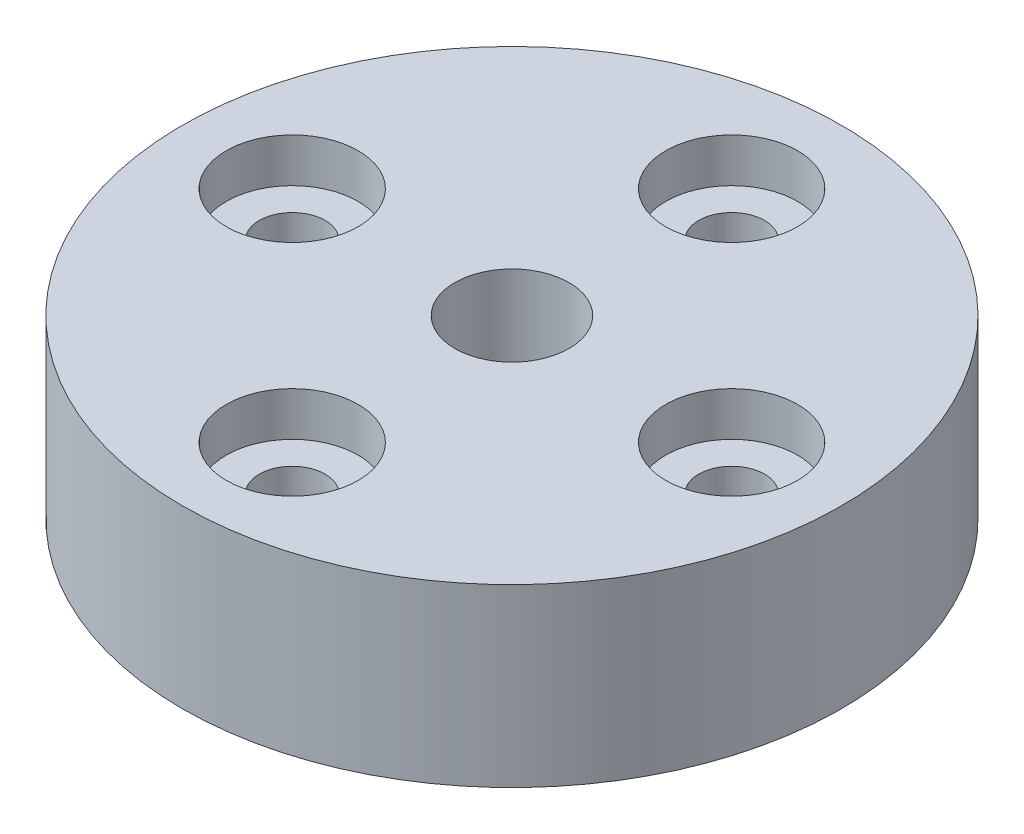
ISO-10303-21;
HEADER;
FILE_DESCRIPTION(('STEP AP214'),'2;1');
FILE_NAME('part.step','',(''),(''),'','','');
FILE_SCHEMA(('AUTOMOTIVE_DESIGN { 1 0 10303 214 1 1 1 1 }'));
ENDSEC;
DATA;
#1=APPLICATION_CONTEXT('core data for automotive mechanical design processes');
#2=APPLICATION_PROTOCOL_DEFINITION('international standard','automotive_design',2000,#1);
#3=PRODUCT_CONTEXT('',#1,'mechanical');
#4=PRODUCT('Part','Part','',(#3));
#5=PRODUCT_RELATED_PRODUCT_CATEGORY('part','',(#4));
#6=PRODUCT_DEFINITION_FORMATION('','',#4);
#7=PRODUCT_DEFINITION_CONTEXT('part definition',#1,'design');
#8=PRODUCT_DEFINITION('design','',#6,#7);
#9=PRODUCT_DEFINITION_SHAPE('','',#8);
#10=(LENGTH_UNIT() NAMED_UNIT(*) SI_UNIT(.MILLI.,.METRE.));
#11=(NAMED_UNIT(*) PLANE_ANGLE_UNIT() SI_UNIT($,.RADIAN.));
#12=(NAMED_UNIT(*) SI_UNIT($,.STERADIAN.) SOLID_ANGLE_UNIT());
#13=UNCERTAINTY_MEASURE_WITH_UNIT(LENGTH_MEASURE(1.E-05),#10,'distance_accuracy_value','');
#14=(GEOMETRIC_REPRESENTATION_CONTEXT(3) GLOBAL_UNCERTAINTY_ASSIGNED_CONTEXT((#13)) GLOBAL_UNIT_ASSIGNED_CONTEXT((#10,
#11,#12)) REPRESENTATION_CONTEXT('',''));
#15=CARTESIAN_POINT('',(0.,0.,0.));
#16=DIRECTION('',(0.,0.,1.));
#17=DIRECTION('',(1.,0.,0.));
#18=AXIS2_PLACEMENT_3D('',#15,#16,#17);
#19=CARTESIAN_POINT('',(5.64760248210638E-13,8.,10.));
#20=DIRECTION('',(0.,-1.,0.));
#21=DIRECTION('',(0.,0.,-1.));
#22=AXIS2_PLACEMENT_3D('',#19,#20,#21);
#23=CYLINDRICAL_SURFACE('',#22,1.50000000000061);
#24=CARTESIAN_POINT('',(5.64760248210638E-13,6.,10.));
#25=DIRECTION('',(0.,1.,0.));
#26=DIRECTION('',(0.,0.,1.));
#27=AXIS2_PLACEMENT_3D('',#24,#25,#26);
#28=CIRCLE('',#27,1.50000000000061);
#29=CARTESIAN_POINT('',(5.64760248210638E-13,6.,11.5000000000006));
#30=VERTEX_POINT('',#29);
#31=EDGE_CURVE('E188',#30,#30,#28,.F.);
#32=ORIENTED_EDGE('',*,*,#31,.F.);
#33=EDGE_LOOP('',(#32));
#34=FACE_BOUND('',#33,.T.);
#35=CARTESIAN_POINT('',(5.64760248210638E-13,2.,10.));
#36=DIRECTION('',(0.,-1.,0.));
#37=DIRECTION('',(0.,0.,-1.));
#38=AXIS2_PLACEMENT_3D('',#35,#36,#37);
#39=CIRCLE('',#38,1.50000000000061);
#40=CARTESIAN_POINT('',(5.64760248210638E-13,2.,8.49999999999939));
#41=VERTEX_POINT('',#40);
#42=EDGE_CURVE('E44',#41,#41,#39,.T.);
#43=ORIENTED_EDGE('',*,*,#42,.T.);
#44=EDGE_LOOP('',(#43));
#45=FACE_BOUND('',#44,.T.);
#46=ADVANCED_FACE('F40',(#34,#45),#23,.F.);
#47=CARTESIAN_POINT('',(10.0000000000003,8.,-2.82380124105319E-13));
#48=DIRECTION('',(0.,-1.,0.));
#49=DIRECTION('',(0.,0.,-1.));
#50=AXIS2_PLACEMENT_3D('',#47,#48,#49);
#51=CYLINDRICAL_SURFACE('',#50,1.50000000000022);
#52=CARTESIAN_POINT('',(10.0000000000003,6.,-2.82380124105319E-13));
#53=DIRECTION('',(0.,1.,0.));
#54=DIRECTION('',(0.,0.,1.));
#55=AXIS2_PLACEMENT_3D('',#52,#53,#54);
#56=CIRCLE('',#55,1.50000000000022);
#57=CARTESIAN_POINT('',(10.0000000000003,6.,1.49999999999994));
#58=VERTEX_POINT('',#57);
#59=EDGE_CURVE('E200',#58,#58,#56,.F.);
#60=ORIENTED_EDGE('',*,*,#59,.F.);
#61=EDGE_LOOP('',(#60));
#62=FACE_BOUND('',#61,.T.);
#63=CARTESIAN_POINT('',(10.0000000000003,2.,-2.82380124105319E-13));
#64=DIRECTION('',(0.,-1.,0.));
#65=DIRECTION('',(0.,0.,-1.));
#66=AXIS2_PLACEMENT_3D('',#63,#64,#65);
#67=CIRCLE('',#66,1.50000000000022);
#68=CARTESIAN_POINT('',(10.0000000000003,2.,-1.5000000000005));
#69=VERTEX_POINT('',#68);
#70=EDGE_CURVE('E74',#69,#69,#67,.T.);
#71=ORIENTED_EDGE('',*,*,#70,.T.);
#72=EDGE_LOOP('',(#71));
#73=FACE_BOUND('',#72,.T.);
#74=ADVANCED_FACE('F125',(#62,#73),#51,.F.);
#75=CARTESIAN_POINT('',(0.,8.,-10.));
#76=DIRECTION('',(0.,-1.,0.));
#77=DIRECTION('',(0.,0.,-1.));
#78=AXIS2_PLACEMENT_3D('',#75,#76,#77);
#79=CYLINDRICAL_SURFACE('',#78,1.5);
#80=CARTESIAN_POINT('',(0.,6.,-10.));
#81=DIRECTION('',(0.,1.,0.));
#82=DIRECTION('',(0.,0.,1.));
#83=AXIS2_PLACEMENT_3D('',#80,#81,#82);
#84=CIRCLE('',#83,1.5);
#85=CARTESIAN_POINT('',(0.,6.,-8.5));
#86=VERTEX_POINT('',#85);
#87=EDGE_CURVE('E61',#86,#86,#84,.T.);
#88=ORIENTED_EDGE('',*,*,#87,.T.);
#89=EDGE_LOOP('',(#88));
#90=FACE_BOUND('',#89,.T.);
#91=CARTESIAN_POINT('',(0.,2.,-10.));
#92=DIRECTION('',(0.,-1.,0.));
#93=DIRECTION('',(0.,0.,-1.));
#94=AXIS2_PLACEMENT_3D('',#91,#92,#93);
#95=CIRCLE('',#94,1.5);
#96=CARTESIAN_POINT('',(0.,2.,-11.5));
#97=VERTEX_POINT('',#96);
#98=EDGE_CURVE('E70',#97,#97,#95,.T.);
#99=ORIENTED_EDGE('',*,*,#98,.T.);
#100=EDGE_LOOP('',(#99));
#101=FACE_BOUND('',#100,.T.);
#102=ADVANCED_FACE('F132',(#90,#101),#79,.F.);
#103=CARTESIAN_POINT('',(-9.99999999999972,8.,2.83604770904466E-13));
#104=DIRECTION('',(0.,-1.,0.));
#105=DIRECTION('',(0.,0.,-1.));
#106=AXIS2_PLACEMENT_3D('',#103,#104,#105);
#107=CYLINDRICAL_SURFACE('',#106,1.50000000000045);
#108=CARTESIAN_POINT('',(-9.99999999999972,6.,2.83604770904466E-13));
#109=DIRECTION('',(0.,1.,0.));
#110=DIRECTION('',(0.,0.,1.));
#111=AXIS2_PLACEMENT_3D('',#108,#109,#110);
#112=CIRCLE('',#111,1.50000000000045);
#113=CARTESIAN_POINT('',(-9.99999999999972,6.,1.50000000000074));
#114=VERTEX_POINT('',#113);
#115=EDGE_CURVE('E173',#114,#114,#112,.F.);
#116=ORIENTED_EDGE('',*,*,#115,.F.);
#117=EDGE_LOOP('',(#116));
#118=FACE_BOUND('',#117,.T.);
#119=CARTESIAN_POINT('',(-9.99999999999972,2.,2.83604770904466E-13));
#120=DIRECTION('',(0.,-1.,0.));
#121=DIRECTION('',(0.,0.,-1.));
#122=AXIS2_PLACEMENT_3D('',#119,#120,#121);
#123=CIRCLE('',#122,1.50000000000045);
#124=CARTESIAN_POINT('',(-9.99999999999972,2.,-1.50000000000017));
#125=VERTEX_POINT('',#124);
#126=EDGE_CURVE('E66',#125,#125,#123,.T.);
#127=ORIENTED_EDGE('',*,*,#126,.T.);
#128=EDGE_LOOP('',(#127));
#129=FACE_BOUND('',#128,.T.);
#130=ADVANCED_FACE('F42',(#118,#129),#107,.F.);
#131=CARTESIAN_POINT('',(0.,8.,0.));
#132=DIRECTION('',(0.,-1.,0.));
#133=DIRECTION('',(0.,0.,-1.));
#134=AXIS2_PLACEMENT_3D('',#131,#132,#133);
#135=CYLINDRICAL_SURFACE('',#134,15.);
#136=CARTESIAN_POINT('',(0.,8.,0.));
#137=DIRECTION('',(0.,1.,0.));
#138=DIRECTION('',(0.,0.,1.));
#139=AXIS2_PLACEMENT_3D('',#136,#137,#138);
#140=CIRCLE('',#139,15.);
#141=CARTESIAN_POINT('',(0.,8.,15.));
#142=VERTEX_POINT('',#141);
#143=EDGE_CURVE('E10',#142,#142,#140,.T.);
#144=ORIENTED_EDGE('',*,*,#143,.F.);
#145=EDGE_LOOP('',(#144));
#146=FACE_BOUND('',#145,.T.);
#147=CARTESIAN_POINT('',(0.,0.,0.));
#148=DIRECTION('',(0.,1.,0.));
#149=DIRECTION('',(0.,0.,1.));
#150=AXIS2_PLACEMENT_3D('',#147,#148,#149);
#151=CIRCLE('',#150,15.);
#152=CARTESIAN_POINT('',(0.,0.,15.));
#153=VERTEX_POINT('',#152);
#154=EDGE_CURVE('E49',#153,#153,#151,.T.);
#155=ORIENTED_EDGE('',*,*,#154,.T.);
#156=EDGE_LOOP('',(#155));
#157=FACE_BOUND('',#156,.T.);
#158=ADVANCED_FACE('F108',(#146,#157),#135,.T.);
#159=CARTESIAN_POINT('',(0.,8.,0.));
#160=DIRECTION('',(0.,1.,0.));
#161=DIRECTION('',(0.,0.,1.));
#162=AXIS2_PLACEMENT_3D('',#159,#160,#161);
#163=PLANE('',#162);
#164=CARTESIAN_POINT('',(-9.99999999999972,8.,2.83604770904466E-13));
#165=DIRECTION('',(0.,1.,0.));
#166=DIRECTION('',(0.,0.,1.));
#167=AXIS2_PLACEMENT_3D('',#164,#165,#166);
#168=CIRCLE('',#167,3.00000000000045);
#169=CARTESIAN_POINT('',(-9.99999999999972,8.,3.00000000000074));
#170=VERTEX_POINT('',#169);
#171=EDGE_CURVE('E177',#170,#170,#168,.T.);
#172=ORIENTED_EDGE('',*,*,#171,.F.);
#173=EDGE_LOOP('',(#172));
#174=FACE_BOUND('',#173,.T.);
#175=CARTESIAN_POINT('',(5.64760248210638E-13,8.,10.));
#176=DIRECTION('',(0.,1.,0.));
#177=DIRECTION('',(0.,0.,1.));
#178=AXIS2_PLACEMENT_3D('',#175,#176,#177);
#179=CIRCLE('',#178,3.00000000000061);
#180=CARTESIAN_POINT('',(5.64760248210638E-13,8.,13.0000000000006));
#181=VERTEX_POINT('',#180);
#182=EDGE_CURVE('E184',#181,#181,#179,.T.);
#183=ORIENTED_EDGE('',*,*,#182,.F.);
#184=EDGE_LOOP('',(#183));
#185=FACE_BOUND('',#184,.T.);
#186=CARTESIAN_POINT('',(10.0000000000003,8.,-2.82380124105319E-13));
#187=DIRECTION('',(0.,1.,0.));
#188=DIRECTION('',(0.,0.,1.));
#189=AXIS2_PLACEMENT_3D('',#186,#187,#188);
#190=CIRCLE('',#189,3.00000000000022);
#191=CARTESIAN_POINT('',(10.0000000000003,8.,2.99999999999994));
#192=VERTEX_POINT('',#191);
#193=EDGE_CURVE('E193',#192,#192,#190,.T.);
#194=ORIENTED_EDGE('',*,*,#193,.F.);
#195=EDGE_LOOP('',(#194));
#196=FACE_BOUND('',#195,.T.);
#197=CARTESIAN_POINT('',(0.,8.,-10.));
#198=DIRECTION('',(0.,1.,0.));
#199=DIRECTION('',(0.,0.,1.));
#200=AXIS2_PLACEMENT_3D('',#197,#198,#199);
#201=CIRCLE('',#200,3.);
#202=CARTESIAN_POINT('',(0.,8.,-7.));
#203=VERTEX_POINT('',#202);
#204=EDGE_CURVE('E86',#203,#203,#201,.T.);
#205=ORIENTED_EDGE('',*,*,#204,.F.);
#206=EDGE_LOOP('',(#205));
#207=FACE_BOUND('',#206,.T.);
#208=CARTESIAN_POINT('',(0.,8.,0.));
#209=DIRECTION('',(0.,1.,0.));
#210=DIRECTION('',(0.,0.,1.));
#211=AXIS2_PLACEMENT_3D('',#208,#209,#210);
#212=CIRCLE('',#211,2.6);
#213=CARTESIAN_POINT('',(0.,8.,2.6));
#214=VERTEX_POINT('',#213);
#215=EDGE_CURVE('E58',#214,#214,#212,.T.);
#216=ORIENTED_EDGE('',*,*,#215,.F.);
#217=EDGE_LOOP('',(#216));
#218=FACE_BOUND('',#217,.T.);
#219=ORIENTED_EDGE('',*,*,#143,.T.);
#220=EDGE_LOOP('',(#219));
#221=FACE_BOUND('',#220,.T.);
#222=ADVANCED_FACE('F105',(#174,#185,#196,#207,#218,#221),#163,.T.);
#223=CARTESIAN_POINT('',(0.,0.,0.));
#224=DIRECTION('',(0.,1.,0.));
#225=DIRECTION('',(0.,0.,1.));
#226=AXIS2_PLACEMENT_3D('',#223,#224,#225);
#227=PLANE('',#226);
#228=CARTESIAN_POINT('',(5.64760248210638E-13,0.,10.));
#229=DIRECTION('',(0.,-1.,0.));
#230=DIRECTION('',(0.,0.,-1.));
#231=AXIS2_PLACEMENT_3D('',#228,#229,#230);
#232=CIRCLE('',#231,3.);
#233=CARTESIAN_POINT('',(5.64760248210638E-13,0.,7.));
#234=VERTEX_POINT('',#233);
#235=EDGE_CURVE('E280',#234,#234,#232,.T.);
#236=ORIENTED_EDGE('',*,*,#235,.F.);
#237=EDGE_LOOP('',(#236));
#238=FACE_BOUND('',#237,.T.);
#239=CARTESIAN_POINT('',(10.0000000000003,0.,-2.86054064502761E-13));
#240=DIRECTION('',(0.,-1.,0.));
#241=DIRECTION('',(0.,0.,-1.));
#242=AXIS2_PLACEMENT_3D('',#239,#240,#241);
#243=CIRCLE('',#242,3.00000000000022);
#244=CARTESIAN_POINT('',(10.0000000000003,0.,-3.0000000000005));
#245=VERTEX_POINT('',#244);
#246=EDGE_CURVE('E284',#245,#245,#243,.T.);
#247=ORIENTED_EDGE('',*,*,#246,.F.);
#248=EDGE_LOOP('',(#247));
#249=FACE_BOUND('',#248,.T.);
#250=CARTESIAN_POINT('',(0.,0.,-10.));
#251=DIRECTION('',(0.,-1.,0.));
#252=DIRECTION('',(0.,0.,-1.));
#253=AXIS2_PLACEMENT_3D('',#250,#251,#252);
#254=CIRCLE('',#253,3.0000000000006);
#255=CARTESIAN_POINT('',(0.,0.,-13.0000000000006));
#256=VERTEX_POINT('',#255);
#257=EDGE_CURVE('E157',#256,#256,#254,.T.);
#258=ORIENTED_EDGE('',*,*,#257,.F.);
#259=EDGE_LOOP('',(#258));
#260=FACE_BOUND('',#259,.T.);
#261=CARTESIAN_POINT('',(-9.99999999999972,0.,2.84829417703614E-13));
#262=DIRECTION('',(0.,-1.,0.));
#263=DIRECTION('',(0.,0.,-1.));
#264=AXIS2_PLACEMENT_3D('',#261,#262,#263);
#265=CIRCLE('',#264,3.00000000000045);
#266=CARTESIAN_POINT('',(-9.99999999999972,0.,-3.00000000000016));
#267=VERTEX_POINT('',#266);
#268=EDGE_CURVE('E158',#267,#267,#265,.T.);
#269=ORIENTED_EDGE('',*,*,#268,.F.);
#270=EDGE_LOOP('',(#269));
#271=FACE_BOUND('',#270,.T.);
#272=CARTESIAN_POINT('',(0.,0.,0.));
#273=DIRECTION('',(0.,1.,0.));
#274=DIRECTION('',(0.,0.,1.));
#275=AXIS2_PLACEMENT_3D('',#272,#273,#274);
#276=CIRCLE('',#275,2.6);
#277=CARTESIAN_POINT('',(0.,0.,2.6));
#278=VERTEX_POINT('',#277);
#279=EDGE_CURVE('E55',#278,#278,#276,.T.);
#280=ORIENTED_EDGE('',*,*,#279,.T.);
#281=EDGE_LOOP('',(#280));
#282=FACE_BOUND('',#281,.T.);
#283=ORIENTED_EDGE('',*,*,#154,.F.);
#284=EDGE_LOOP('',(#283));
#285=FACE_BOUND('',#284,.T.);
#286=ADVANCED_FACE('F107',(#238,#249,#260,#271,#282,#285),#227,.F.);
#287=CARTESIAN_POINT('',(0.,0.,0.));
#288=DIRECTION('',(0.,1.,0.));
#289=DIRECTION('',(0.,0.,1.));
#290=AXIS2_PLACEMENT_3D('',#287,#288,#289);
#291=CYLINDRICAL_SURFACE('',#290,2.6);
#292=ORIENTED_EDGE('',*,*,#279,.F.);
#293=EDGE_LOOP('',(#292));
#294=FACE_BOUND('',#293,.T.);
#295=ORIENTED_EDGE('',*,*,#215,.T.);
#296=EDGE_LOOP('',(#295));
#297=FACE_BOUND('',#296,.T.);
#298=ADVANCED_FACE('F103',(#294,#297),#291,.F.);
#299=CARTESIAN_POINT('',(0.,6.,-10.));
#300=DIRECTION('',(0.,1.,0.));
#301=DIRECTION('',(0.,0.,1.));
#302=AXIS2_PLACEMENT_3D('',#299,#300,#301);
#303=CYLINDRICAL_SURFACE('',#302,3.);
#304=CARTESIAN_POINT('',(0.,6.,-10.));
#305=DIRECTION('',(0.,1.,0.));
#306=DIRECTION('',(0.,0.,1.));
#307=AXIS2_PLACEMENT_3D('',#304,#305,#306);
#308=CIRCLE('',#307,3.);
#309=CARTESIAN_POINT('',(0.,6.,-7.));
#310=VERTEX_POINT('',#309);
#311=EDGE_CURVE('E81',#310,#310,#308,.T.);
#312=ORIENTED_EDGE('',*,*,#311,.F.);
#313=EDGE_LOOP('',(#312));
#314=FACE_BOUND('',#313,.T.);
#315=ORIENTED_EDGE('',*,*,#204,.T.);
#316=EDGE_LOOP('',(#315));
#317=FACE_BOUND('',#316,.T.);
#318=ADVANCED_FACE('F224',(#314,#317),#303,.F.);
#319=CARTESIAN_POINT('',(0.,6.,-10.));
#320=DIRECTION('',(0.,1.,0.));
#321=DIRECTION('',(0.,0.,1.));
#322=AXIS2_PLACEMENT_3D('',#319,#320,#321);
#323=PLANE('',#322);
#324=ORIENTED_EDGE('',*,*,#87,.F.);
#325=EDGE_LOOP('',(#324));
#326=FACE_BOUND('',#325,.T.);
#327=ORIENTED_EDGE('',*,*,#311,.T.);
#328=EDGE_LOOP('',(#327));
#329=FACE_BOUND('',#328,.T.);
#330=ADVANCED_FACE('F217',(#326,#329),#323,.T.);
#331=CARTESIAN_POINT('',(10.0000000000003,6.,-2.82380124105319E-13));
#332=DIRECTION('',(0.,1.,0.));
#333=DIRECTION('',(0.,0.,1.));
#334=AXIS2_PLACEMENT_3D('',#331,#332,#333);
#335=CYLINDRICAL_SURFACE('',#334,3.00000000000022);
#336=CARTESIAN_POINT('',(10.0000000000003,6.,-2.82380124105319E-13));
#337=DIRECTION('',(0.,1.,0.));
#338=DIRECTION('',(0.,0.,1.));
#339=AXIS2_PLACEMENT_3D('',#336,#337,#338);
#340=CIRCLE('',#339,3.00000000000022);
#341=CARTESIAN_POINT('',(10.0000000000003,6.,2.99999999999994));
#342=VERTEX_POINT('',#341);
#343=EDGE_CURVE('E92',#342,#342,#340,.T.);
#344=ORIENTED_EDGE('',*,*,#343,.F.);
#345=EDGE_LOOP('',(#344));
#346=FACE_BOUND('',#345,.T.);
#347=ORIENTED_EDGE('',*,*,#193,.T.);
#348=EDGE_LOOP('',(#347));
#349=FACE_BOUND('',#348,.T.);
#350=ADVANCED_FACE('F211',(#346,#349),#335,.F.);
#351=CARTESIAN_POINT('',(0.,6.,0.));
#352=DIRECTION('',(0.,1.,0.));
#353=DIRECTION('',(0.,0.,1.));
#354=AXIS2_PLACEMENT_3D('',#351,#352,#353);
#355=PLANE('',#354);
#356=ORIENTED_EDGE('',*,*,#59,.T.);
#357=EDGE_LOOP('',(#356));
#358=FACE_BOUND('',#357,.T.);
#359=ORIENTED_EDGE('',*,*,#343,.T.);
#360=EDGE_LOOP('',(#359));
#361=FACE_BOUND('',#360,.T.);
#362=ADVANCED_FACE('F207',(#358,#361),#355,.T.);
#363=CARTESIAN_POINT('',(5.64760248210638E-13,6.,10.));
#364=DIRECTION('',(0.,1.,0.));
#365=DIRECTION('',(0.,0.,1.));
#366=AXIS2_PLACEMENT_3D('',#363,#364,#365);
#367=CYLINDRICAL_SURFACE('',#366,3.00000000000061);
#368=CARTESIAN_POINT('',(5.64760248210638E-13,6.,10.));
#369=DIRECTION('',(0.,1.,0.));
#370=DIRECTION('',(0.,0.,1.));
#371=AXIS2_PLACEMENT_3D('',#368,#369,#370);
#372=CIRCLE('',#371,3.00000000000061);
#373=CARTESIAN_POINT('',(5.64760248210638E-13,6.,13.0000000000006));
#374=VERTEX_POINT('',#373);
#375=EDGE_CURVE('E189',#374,#374,#372,.T.);
#376=ORIENTED_EDGE('',*,*,#375,.F.);
#377=EDGE_LOOP('',(#376));
#378=FACE_BOUND('',#377,.T.);
#379=ORIENTED_EDGE('',*,*,#182,.T.);
#380=EDGE_LOOP('',(#379));
#381=FACE_BOUND('',#380,.T.);
#382=ADVANCED_FACE('F210',(#378,#381),#367,.F.);
#383=CARTESIAN_POINT('',(0.,6.,0.));
#384=DIRECTION('',(0.,1.,0.));
#385=DIRECTION('',(0.,0.,1.));
#386=AXIS2_PLACEMENT_3D('',#383,#384,#385);
#387=PLANE('',#386);
#388=ORIENTED_EDGE('',*,*,#31,.T.);
#389=EDGE_LOOP('',(#388));
#390=FACE_BOUND('',#389,.T.);
#391=ORIENTED_EDGE('',*,*,#375,.T.);
#392=EDGE_LOOP('',(#391));
#393=FACE_BOUND('',#392,.T.);
#394=ADVANCED_FACE('F235',(#390,#393),#387,.T.);
#395=CARTESIAN_POINT('',(-9.99999999999972,6.,2.83604770904466E-13));
#396=DIRECTION('',(0.,1.,0.));
#397=DIRECTION('',(0.,0.,1.));
#398=AXIS2_PLACEMENT_3D('',#395,#396,#397);
#399=CYLINDRICAL_SURFACE('',#398,3.00000000000045);
#400=CARTESIAN_POINT('',(-9.99999999999972,6.,2.83604770904466E-13));
#401=DIRECTION('',(0.,1.,0.));
#402=DIRECTION('',(0.,0.,1.));
#403=AXIS2_PLACEMENT_3D('',#400,#401,#402);
#404=CIRCLE('',#403,3.00000000000045);
#405=CARTESIAN_POINT('',(-9.99999999999972,6.,3.00000000000074));
#406=VERTEX_POINT('',#405);
#407=EDGE_CURVE('E65',#406,#406,#404,.T.);
#408=ORIENTED_EDGE('',*,*,#407,.F.);
#409=EDGE_LOOP('',(#408));
#410=FACE_BOUND('',#409,.T.);
#411=ORIENTED_EDGE('',*,*,#171,.T.);
#412=EDGE_LOOP('',(#411));
#413=FACE_BOUND('',#412,.T.);
#414=ADVANCED_FACE('F238',(#410,#413),#399,.F.);
#415=CARTESIAN_POINT('',(0.,6.,0.));
#416=DIRECTION('',(0.,1.,0.));
#417=DIRECTION('',(0.,0.,1.));
#418=AXIS2_PLACEMENT_3D('',#415,#416,#417);
#419=PLANE('',#418);
#420=ORIENTED_EDGE('',*,*,#115,.T.);
#421=EDGE_LOOP('',(#420));
#422=FACE_BOUND('',#421,.T.);
#423=ORIENTED_EDGE('',*,*,#407,.T.);
#424=EDGE_LOOP('',(#423));
#425=FACE_BOUND('',#424,.T.);
#426=ADVANCED_FACE('F245',(#422,#425),#419,.T.);
#427=CARTESIAN_POINT('',(-9.99999999999972,2.,2.84829417703614E-13));
#428=DIRECTION('',(0.,-1.,0.));
#429=DIRECTION('',(0.,0.,-1.));
#430=AXIS2_PLACEMENT_3D('',#427,#428,#429);
#431=CYLINDRICAL_SURFACE('',#430,3.00000000000045);
#432=CARTESIAN_POINT('',(-9.99999999999972,2.,2.84829417703614E-13));
#433=DIRECTION('',(0.,-1.,0.));
#434=DIRECTION('',(0.,0.,-1.));
#435=AXIS2_PLACEMENT_3D('',#432,#433,#434);
#436=CIRCLE('',#435,3.00000000000045);
#437=CARTESIAN_POINT('',(-9.99999999999972,2.,-3.00000000000016));
#438=VERTEX_POINT('',#437);
#439=EDGE_CURVE('E166',#438,#438,#436,.T.);
#440=ORIENTED_EDGE('',*,*,#439,.F.);
#441=EDGE_LOOP('',(#440));
#442=FACE_BOUND('',#441,.T.);
#443=ORIENTED_EDGE('',*,*,#268,.T.);
#444=EDGE_LOOP('',(#443));
#445=FACE_BOUND('',#444,.T.);
#446=ADVANCED_FACE('F249',(#442,#445),#431,.F.);
#447=CARTESIAN_POINT('',(-9.99999999999972,2.,2.84829417703614E-13));
#448=DIRECTION('',(0.,-1.,0.));
#449=DIRECTION('',(0.,0.,-1.));
#450=AXIS2_PLACEMENT_3D('',#447,#448,#449);
#451=PLANE('',#450);
#452=ORIENTED_EDGE('',*,*,#126,.F.);
#453=EDGE_LOOP('',(#452));
#454=FACE_BOUND('',#453,.T.);
#455=ORIENTED_EDGE('',*,*,#439,.T.);
#456=EDGE_LOOP('',(#455));
#457=FACE_BOUND('',#456,.T.);
#458=ADVANCED_FACE('F251',(#454,#457),#451,.T.);
#459=CARTESIAN_POINT('',(0.,2.,-10.));
#460=DIRECTION('',(0.,-1.,0.));
#461=DIRECTION('',(0.,0.,-1.));
#462=AXIS2_PLACEMENT_3D('',#459,#460,#461);
#463=CYLINDRICAL_SURFACE('',#462,3.0000000000006);
#464=CARTESIAN_POINT('',(0.,2.,-10.));
#465=DIRECTION('',(0.,-1.,0.));
#466=DIRECTION('',(0.,0.,-1.));
#467=AXIS2_PLACEMENT_3D('',#464,#465,#466);
#468=CIRCLE('',#467,3.0000000000006);
#469=CARTESIAN_POINT('',(0.,2.,-13.0000000000006));
#470=VERTEX_POINT('',#469);
#471=EDGE_CURVE('E154',#470,#470,#468,.T.);
#472=ORIENTED_EDGE('',*,*,#471,.F.);
#473=EDGE_LOOP('',(#472));
#474=FACE_BOUND('',#473,.T.);
#475=ORIENTED_EDGE('',*,*,#257,.T.);
#476=EDGE_LOOP('',(#475));
#477=FACE_BOUND('',#476,.T.);
#478=ADVANCED_FACE('F150',(#474,#477),#463,.F.);
#479=CARTESIAN_POINT('',(0.,2.,-10.));
#480=DIRECTION('',(0.,-1.,0.));
#481=DIRECTION('',(0.,0.,-1.));
#482=AXIS2_PLACEMENT_3D('',#479,#480,#481);
#483=PLANE('',#482);
#484=ORIENTED_EDGE('',*,*,#98,.F.);
#485=EDGE_LOOP('',(#484));
#486=FACE_BOUND('',#485,.T.);
#487=ORIENTED_EDGE('',*,*,#471,.T.);
#488=EDGE_LOOP('',(#487));
#489=FACE_BOUND('',#488,.T.);
#490=ADVANCED_FACE('F146',(#486,#489),#483,.T.);
#491=CARTESIAN_POINT('',(10.0000000000003,2.,-2.86054064502761E-13));
#492=DIRECTION('',(0.,-1.,0.));
#493=DIRECTION('',(0.,0.,-1.));
#494=AXIS2_PLACEMENT_3D('',#491,#492,#493);
#495=CYLINDRICAL_SURFACE('',#494,3.00000000000022);
#496=CARTESIAN_POINT('',(10.0000000000003,2.,-2.86054064502761E-13));
#497=DIRECTION('',(0.,-1.,0.));
#498=DIRECTION('',(0.,0.,-1.));
#499=AXIS2_PLACEMENT_3D('',#496,#497,#498);
#500=CIRCLE('',#499,3.00000000000022);
#501=CARTESIAN_POINT('',(10.0000000000003,2.,-3.0000000000005));
#502=VERTEX_POINT('',#501);
#503=EDGE_CURVE('E163',#502,#502,#500,.T.);
#504=ORIENTED_EDGE('',*,*,#503,.F.);
#505=EDGE_LOOP('',(#504));
#506=FACE_BOUND('',#505,.T.);
#507=ORIENTED_EDGE('',*,*,#246,.T.);
#508=EDGE_LOOP('',(#507));
#509=FACE_BOUND('',#508,.T.);
#510=ADVANCED_FACE('F149',(#506,#509),#495,.F.);
#511=CARTESIAN_POINT('',(10.0000000000003,2.,-2.86054064502761E-13));
#512=DIRECTION('',(0.,-1.,0.));
#513=DIRECTION('',(0.,0.,-1.));
#514=AXIS2_PLACEMENT_3D('',#511,#512,#513);
#515=PLANE('',#514);
#516=ORIENTED_EDGE('',*,*,#70,.F.);
#517=EDGE_LOOP('',(#516));
#518=FACE_BOUND('',#517,.T.);
#519=ORIENTED_EDGE('',*,*,#503,.T.);
#520=EDGE_LOOP('',(#519));
#521=FACE_BOUND('',#520,.T.);
#522=ADVANCED_FACE('F260',(#518,#521),#515,.T.);
#523=CARTESIAN_POINT('',(5.64760248210638E-13,2.,10.));
#524=DIRECTION('',(0.,-1.,0.));
#525=DIRECTION('',(0.,0.,-1.));
#526=AXIS2_PLACEMENT_3D('',#523,#524,#525);
#527=CYLINDRICAL_SURFACE('',#526,3.);
#528=CARTESIAN_POINT('',(5.64760248210638E-13,2.,10.));
#529=DIRECTION('',(0.,-1.,0.));
#530=DIRECTION('',(0.,0.,-1.));
#531=AXIS2_PLACEMENT_3D('',#528,#529,#530);
#532=CIRCLE('',#531,3.);
#533=CARTESIAN_POINT('',(5.64760248210638E-13,2.,7.));
#534=VERTEX_POINT('',#533);
#535=EDGE_CURVE('E71',#534,#534,#532,.T.);
#536=ORIENTED_EDGE('',*,*,#535,.F.);
#537=EDGE_LOOP('',(#536));
#538=FACE_BOUND('',#537,.T.);
#539=ORIENTED_EDGE('',*,*,#235,.T.);
#540=EDGE_LOOP('',(#539));
#541=FACE_BOUND('',#540,.T.);
#542=ADVANCED_FACE('F263',(#538,#541),#527,.F.);
#543=CARTESIAN_POINT('',(5.64760248210638E-13,2.,10.));
#544=DIRECTION('',(0.,-1.,0.));
#545=DIRECTION('',(0.,0.,-1.));
#546=AXIS2_PLACEMENT_3D('',#543,#544,#545);
#547=PLANE('',#546);
#548=ORIENTED_EDGE('',*,*,#42,.F.);
#549=EDGE_LOOP('',(#548));
#550=FACE_BOUND('',#549,.T.);
#551=ORIENTED_EDGE('',*,*,#535,.T.);
#552=EDGE_LOOP('',(#551));
#553=FACE_BOUND('',#552,.T.);
#554=ADVANCED_FACE('F270',(#550,#553),#547,.T.);
#555=CLOSED_SHELL('',(#46,#74,#102,#130,#158,#222,#286,#298,#318,#330,#350,#362,#382,#394,#414,
#426,#446,#458,#478,#490,#510,#522,#542,#554));
#556=MANIFOLD_SOLID_BREP('B2',#555);
#557=ADVANCED_BREP_SHAPE_REPRESENTATION('',(#18,#556),#14);
#558=SHAPE_DEFINITION_REPRESENTATION(#9,#557);
ENDSEC;
END-ISO-10303-21;
